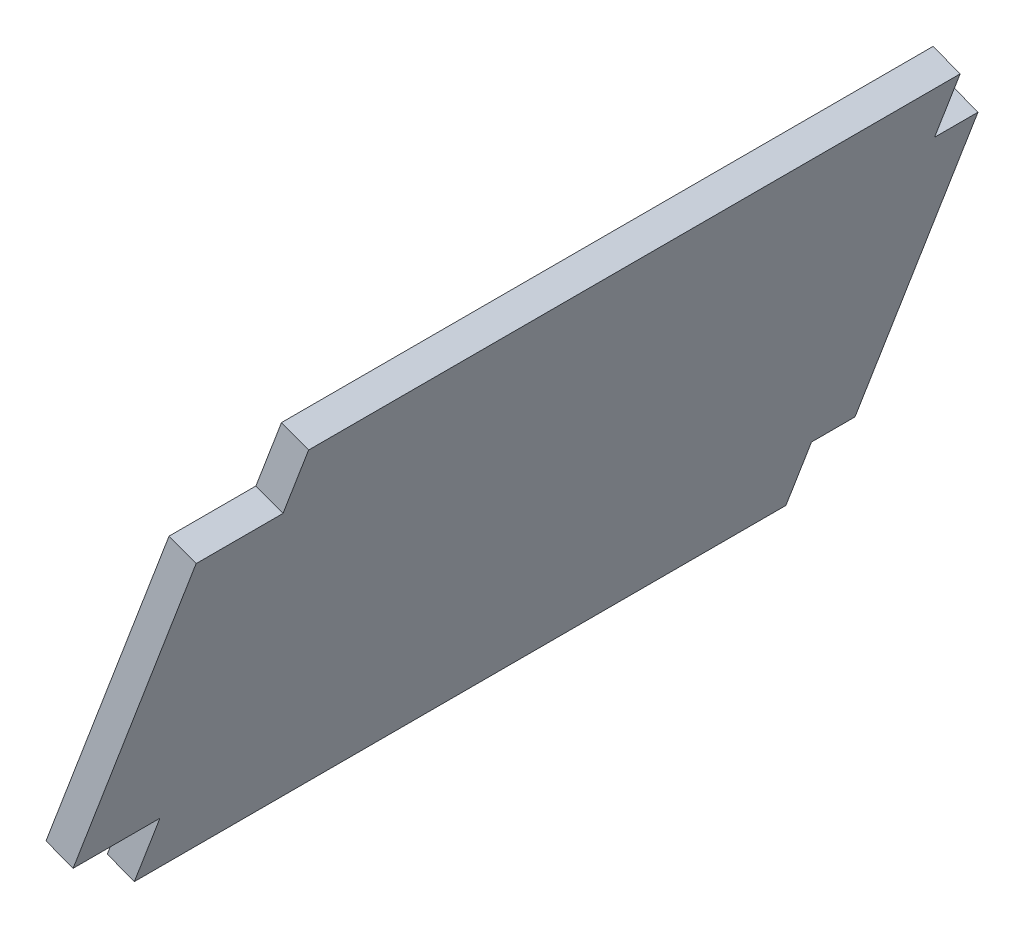
ISO-10303-21;
HEADER;
FILE_DESCRIPTION(('STEP AP214'),'2;1');
FILE_NAME('part.step','',(''),(''),'','','');
FILE_SCHEMA(('AUTOMOTIVE_DESIGN { 1 0 10303 214 1 1 1 1 }'));
ENDSEC;
DATA;
#1=APPLICATION_CONTEXT('core data for automotive mechanical design processes');
#2=APPLICATION_PROTOCOL_DEFINITION('international standard','automotive_design',2000,#1);
#3=PRODUCT_CONTEXT('',#1,'mechanical');
#4=PRODUCT('Part','Part','',(#3));
#5=PRODUCT_RELATED_PRODUCT_CATEGORY('part','',(#4));
#6=PRODUCT_DEFINITION_FORMATION('','',#4);
#7=PRODUCT_DEFINITION_CONTEXT('part definition',#1,'design');
#8=PRODUCT_DEFINITION('design','',#6,#7);
#9=PRODUCT_DEFINITION_SHAPE('','',#8);
#10=(LENGTH_UNIT() NAMED_UNIT(*) SI_UNIT(.MILLI.,.METRE.));
#11=(NAMED_UNIT(*) PLANE_ANGLE_UNIT() SI_UNIT($,.RADIAN.));
#12=(NAMED_UNIT(*) SI_UNIT($,.STERADIAN.) SOLID_ANGLE_UNIT());
#13=UNCERTAINTY_MEASURE_WITH_UNIT(LENGTH_MEASURE(1.E-05),#10,'distance_accuracy_value','');
#14=(GEOMETRIC_REPRESENTATION_CONTEXT(3) GLOBAL_UNCERTAINTY_ASSIGNED_CONTEXT((#13)) GLOBAL_UNIT_ASSIGNED_CONTEXT((#10,
#11,#12)) REPRESENTATION_CONTEXT('',''));
#15=CARTESIAN_POINT('',(0.,0.,0.));
#16=DIRECTION('',(0.,0.,1.));
#17=DIRECTION('',(1.,0.,0.));
#18=AXIS2_PLACEMENT_3D('',#15,#16,#17);
#19=CARTESIAN_POINT('',(227.031313309639,-60.5629079915328,-73.3961625225206));
#20=DIRECTION('',(0.353621589287121,0.935388567168773,0.));
#21=DIRECTION('',(-0.935388567168774,0.353621589287121,0.));
#22=AXIS2_PLACEMENT_3D('',#19,#20,#21);
#23=PLANE('',#22);
#24=DIRECTION('',(0.,0.,1.));
#25=VECTOR('',#24,1.);
#26=CARTESIAN_POINT('',(227.031313309639,-60.5629079915328,-73.3961625225206));
#27=LINE('',#26,#25);
#28=CARTESIAN_POINT('',(227.031313309639,-60.5629079915328,-48.));
#29=VERTEX_POINT('',#28);
#30=CARTESIAN_POINT('',(227.031313309638,-60.562907991533,-45.));
#31=VERTEX_POINT('',#30);
#32=EDGE_CURVE('E179',#29,#31,#27,.T.);
#33=ORIENTED_EDGE('',*,*,#32,.F.);
#34=DIRECTION('',(0.935388567168774,-0.353621589287121,0.));
#35=VECTOR('',#34,1.);
#36=CARTESIAN_POINT('',(227.031313309639,-60.5629079915328,-48.));
#37=LINE('',#36,#35);
#38=CARTESIAN_POINT('',(228.902090443976,-61.270151170107,-48.));
#39=VERTEX_POINT('',#38);
#40=EDGE_CURVE('E11',#29,#39,#37,.T.);
#41=ORIENTED_EDGE('',*,*,#40,.T.);
#42=DIRECTION('',(0.,0.,1.));
#43=VECTOR('',#42,1.);
#44=CARTESIAN_POINT('',(228.902090443976,-61.270151170107,-73.3961625225206));
#45=LINE('',#44,#43);
#46=CARTESIAN_POINT('',(228.902090443976,-61.2701511701072,-45.));
#47=VERTEX_POINT('',#46);
#48=EDGE_CURVE('E181',#39,#47,#45,.T.);
#49=ORIENTED_EDGE('',*,*,#48,.T.);
#50=DIRECTION('',(0.935388567168775,-0.353621589287116,0.));
#51=VECTOR('',#50,1.);
#52=CARTESIAN_POINT('',(227.031313309638,-60.562907991533,-45.));
#53=LINE('',#52,#51);
#54=EDGE_CURVE('E146',#31,#47,#53,.T.);
#55=ORIENTED_EDGE('',*,*,#54,.F.);
#56=EDGE_LOOP('',(#33,#41,#49,#55));
#57=FACE_BOUND('',#56,.T.);
#58=ADVANCED_FACE('F33',(#57),#23,.F.);
#59=CARTESIAN_POINT('',(237.399172674298,-38.7939398376526,-73.3961625225206));
#60=DIRECTION('',(-0.353621589287121,-0.935388567168773,0.));
#61=DIRECTION('',(0.935388567168774,-0.353621589287121,0.));
#62=AXIS2_PLACEMENT_3D('',#59,#60,#61);
#63=PLANE('',#62);
#64=DIRECTION('',(-0.935388567168772,0.353621589287125,0.));
#65=VECTOR('',#64,1.);
#66=CARTESIAN_POINT('',(235.52839553996,-38.0866966590784,0.));
#67=LINE('',#66,#65);
#68=CARTESIAN_POINT('',(237.399172674298,-38.7939398376526,0.));
#69=VERTEX_POINT('',#68);
#70=CARTESIAN_POINT('',(235.52839553996,-38.0866966590784,0.));
#71=VERTEX_POINT('',#70);
#72=EDGE_CURVE('E228',#69,#71,#67,.T.);
#73=ORIENTED_EDGE('',*,*,#72,.T.);
#74=DIRECTION('',(0.,0.,1.));
#75=VECTOR('',#74,1.);
#76=CARTESIAN_POINT('',(235.52839553996,-38.0866966590784,-73.3961625225206));
#77=LINE('',#76,#75);
#78=CARTESIAN_POINT('',(235.52839553996,-38.0866966590784,6.));
#79=VERTEX_POINT('',#78);
#80=EDGE_CURVE('E253',#71,#79,#77,.T.);
#81=ORIENTED_EDGE('',*,*,#80,.T.);
#82=DIRECTION('',(0.935388567168773,-0.35362158928712,0.));
#83=VECTOR('',#82,1.);
#84=CARTESIAN_POINT('',(237.399172674298,-38.7939398376526,6.));
#85=LINE('',#84,#83);
#86=CARTESIAN_POINT('',(237.399172674298,-38.7939398376526,6.));
#87=VERTEX_POINT('',#86);
#88=EDGE_CURVE('E215',#79,#87,#85,.T.);
#89=ORIENTED_EDGE('',*,*,#88,.T.);
#90=DIRECTION('',(0.,0.,1.));
#91=VECTOR('',#90,1.);
#92=CARTESIAN_POINT('',(237.399172674298,-38.7939398376526,-73.3961625225206));
#93=LINE('',#92,#91);
#94=EDGE_CURVE('E214',#69,#87,#93,.T.);
#95=ORIENTED_EDGE('',*,*,#94,.F.);
#96=EDGE_LOOP('',(#73,#81,#89,#95));
#97=FACE_BOUND('',#96,.T.);
#98=ADVANCED_FACE('F284',(#97),#63,.F.);
#99=DIRECTION('',(0.935388567168771,-0.353621589287127,0.));
#100=VECTOR('',#99,1.);
#101=CARTESIAN_POINT('',(235.52839553996,-38.0866966590784,-45.));
#102=LINE('',#101,#100);
#103=CARTESIAN_POINT('',(235.52839553996,-38.0866966590784,-45.));
#104=VERTEX_POINT('',#103);
#105=CARTESIAN_POINT('',(237.399172674298,-38.7939398376527,-45.));
#106=VERTEX_POINT('',#105);
#107=EDGE_CURVE('E140',#104,#106,#102,.T.);
#108=ORIENTED_EDGE('',*,*,#107,.T.);
#109=CARTESIAN_POINT('',(237.399172674298,-38.7939398376526,-48.));
#110=VERTEX_POINT('',#109);
#111=EDGE_CURVE('E256',#110,#106,#93,.T.);
#112=ORIENTED_EDGE('',*,*,#111,.F.);
#113=DIRECTION('',(-0.935388567168774,0.353621589287121,0.));
#114=VECTOR('',#113,1.);
#115=CARTESIAN_POINT('',(237.399172674298,-38.7939398376526,-48.));
#116=LINE('',#115,#114);
#117=CARTESIAN_POINT('',(235.52839553996,-38.0866966590784,-48.));
#118=VERTEX_POINT('',#117);
#119=EDGE_CURVE('E204',#110,#118,#116,.T.);
#120=ORIENTED_EDGE('',*,*,#119,.T.);
#121=EDGE_CURVE('E187',#118,#104,#77,.T.);
#122=ORIENTED_EDGE('',*,*,#121,.T.);
#123=EDGE_LOOP('',(#108,#112,#120,#122));
#124=FACE_BOUND('',#123,.T.);
#125=ADVANCED_FACE('F262',(#124),#63,.F.);
#126=CARTESIAN_POINT('',(235.52839553996,-38.0866966590784,-73.3961625225206));
#127=DIRECTION('',(0.935388567168774,-0.353621589287119,0.));
#128=DIRECTION('',(0.353621589287119,0.935388567168774,0.));
#129=AXIS2_PLACEMENT_3D('',#126,#127,#128);
#130=PLANE('',#129);
#131=DIRECTION('',(-0.353621589287119,-0.935388567168774,0.));
#132=VECTOR('',#131,1.);
#133=CARTESIAN_POINT('',(235.52839553996,-38.0866966590784,-48.));
#134=LINE('',#133,#132);
#135=EDGE_CURVE('E42',#118,#29,#134,.T.);
#136=ORIENTED_EDGE('',*,*,#135,.T.);
#137=ORIENTED_EDGE('',*,*,#32,.T.);
#138=DIRECTION('',(0.353621589287122,0.935388567168773,0.));
#139=VECTOR('',#138,1.);
#140=CARTESIAN_POINT('',(225.263205363203,-65.2398508273769,-45.));
#141=LINE('',#140,#139);
#142=CARTESIAN_POINT('',(225.263205363203,-65.2398508273769,-45.));
#143=VERTEX_POINT('',#142);
#144=EDGE_CURVE('E145',#143,#31,#141,.T.);
#145=ORIENTED_EDGE('',*,*,#144,.F.);
#146=DIRECTION('',(0.,0.,-1.));
#147=VECTOR('',#146,1.);
#148=CARTESIAN_POINT('',(225.263205363203,-65.2398508273769,0.));
#149=LINE('',#148,#147);
#150=CARTESIAN_POINT('',(225.263205363203,-65.2398508273769,0.));
#151=VERTEX_POINT('',#150);
#152=EDGE_CURVE('E129',#151,#143,#149,.T.);
#153=ORIENTED_EDGE('',*,*,#152,.F.);
#154=DIRECTION('',(0.353621589287122,0.935388567168773,0.));
#155=VECTOR('',#154,1.);
#156=CARTESIAN_POINT('',(225.263205363203,-65.2398508273769,0.));
#157=LINE('',#156,#155);
#158=CARTESIAN_POINT('',(227.031313309639,-60.5629079915328,0.));
#159=VERTEX_POINT('',#158);
#160=EDGE_CURVE('E136',#151,#159,#157,.T.);
#161=ORIENTED_EDGE('',*,*,#160,.T.);
#162=CARTESIAN_POINT('',(227.031313309639,-60.5629079915328,6.));
#163=VERTEX_POINT('',#162);
#164=EDGE_CURVE('E184',#159,#163,#27,.T.);
#165=ORIENTED_EDGE('',*,*,#164,.T.);
#166=DIRECTION('',(0.353621589287119,0.935388567168774,0.));
#167=VECTOR('',#166,1.);
#168=CARTESIAN_POINT('',(235.52839553996,-38.0866966590784,6.));
#169=LINE('',#168,#167);
#170=EDGE_CURVE('E212',#163,#79,#169,.T.);
#171=ORIENTED_EDGE('',*,*,#170,.T.);
#172=ORIENTED_EDGE('',*,*,#80,.F.);
#173=DIRECTION('',(-0.353621589287121,-0.935388567168773,0.));
#174=VECTOR('',#173,1.);
#175=CARTESIAN_POINT('',(237.296503486396,-33.4097538232346,0.));
#176=LINE('',#175,#174);
#177=CARTESIAN_POINT('',(237.296503486396,-33.4097538232346,0.));
#178=VERTEX_POINT('',#177);
#179=EDGE_CURVE('E58',#178,#71,#176,.T.);
#180=ORIENTED_EDGE('',*,*,#179,.F.);
#181=DIRECTION('',(0.,0.,-1.));
#182=VECTOR('',#181,1.);
#183=CARTESIAN_POINT('',(237.296503486396,-33.4097538232346,0.));
#184=LINE('',#183,#182);
#185=CARTESIAN_POINT('',(237.296503486396,-33.4097538232345,-45.));
#186=VERTEX_POINT('',#185);
#187=EDGE_CURVE('E232',#178,#186,#184,.T.);
#188=ORIENTED_EDGE('',*,*,#187,.T.);
#189=DIRECTION('',(-0.353621589287121,-0.935388567168773,0.));
#190=VECTOR('',#189,1.);
#191=CARTESIAN_POINT('',(237.296503486396,-33.4097538232345,-45.));
#192=LINE('',#191,#190);
#193=EDGE_CURVE('E222',#186,#104,#192,.T.);
#194=ORIENTED_EDGE('',*,*,#193,.T.);
#195=ORIENTED_EDGE('',*,*,#121,.F.);
#196=EDGE_LOOP('',(#136,#137,#145,#153,#161,#165,#171,#172,#180,#188,#194,#195));
#197=FACE_BOUND('',#196,.T.);
#198=ADVANCED_FACE('F143',(#197),#130,.F.);
#199=CARTESIAN_POINT('',(228.902090443976,-61.2701511701072,0.));
#200=VERTEX_POINT('',#199);
#201=CARTESIAN_POINT('',(228.902090443976,-61.270151170107,6.));
#202=VERTEX_POINT('',#201);
#203=EDGE_CURVE('E160',#200,#202,#45,.T.);
#204=ORIENTED_EDGE('',*,*,#203,.T.);
#205=DIRECTION('',(-0.935388567168773,0.35362158928712,0.));
#206=VECTOR('',#205,1.);
#207=CARTESIAN_POINT('',(227.031313309639,-60.5629079915328,6.));
#208=LINE('',#207,#206);
#209=EDGE_CURVE('E220',#202,#163,#208,.T.);
#210=ORIENTED_EDGE('',*,*,#209,.T.);
#211=ORIENTED_EDGE('',*,*,#164,.F.);
#212=DIRECTION('',(-0.935388567168775,0.353621589287117,0.));
#213=VECTOR('',#212,1.);
#214=CARTESIAN_POINT('',(227.031313309639,-60.562907991533,0.));
#215=LINE('',#214,#213);
#216=EDGE_CURVE('E50',#200,#159,#215,.T.);
#217=ORIENTED_EDGE('',*,*,#216,.F.);
#218=EDGE_LOOP('',(#204,#210,#211,#217));
#219=FACE_BOUND('',#218,.T.);
#220=ADVANCED_FACE('F286',(#219),#23,.F.);
#221=CARTESIAN_POINT('',(228.902090443976,-61.270151170107,-73.3961625225206));
#222=DIRECTION('',(-0.935388567168774,0.353621589287119,0.));
#223=DIRECTION('',(-0.353621589287119,-0.935388567168774,0.));
#224=AXIS2_PLACEMENT_3D('',#221,#222,#223);
#225=PLANE('',#224);
#226=DIRECTION('',(0.353621589287119,0.935388567168774,0.));
#227=VECTOR('',#226,1.);
#228=CARTESIAN_POINT('',(228.902090443976,-61.270151170107,-48.));
#229=LINE('',#228,#227);
#230=EDGE_CURVE('E203',#39,#110,#229,.T.);
#231=ORIENTED_EDGE('',*,*,#230,.T.);
#232=ORIENTED_EDGE('',*,*,#111,.T.);
#233=DIRECTION('',(-0.353621589287121,-0.935388567168773,0.));
#234=VECTOR('',#233,1.);
#235=CARTESIAN_POINT('',(239.167280620733,-34.1169970018088,-45.));
#236=LINE('',#235,#234);
#237=CARTESIAN_POINT('',(239.167280620733,-34.1169970018088,-45.));
#238=VERTEX_POINT('',#237);
#239=EDGE_CURVE('E239',#238,#106,#236,.T.);
#240=ORIENTED_EDGE('',*,*,#239,.F.);
#241=DIRECTION('',(0.,0.,1.));
#242=VECTOR('',#241,1.);
#243=CARTESIAN_POINT('',(239.167280620733,-34.1169970018088,0.));
#244=LINE('',#243,#242);
#245=CARTESIAN_POINT('',(239.167280620733,-34.1169970018088,0.));
#246=VERTEX_POINT('',#245);
#247=EDGE_CURVE('E270',#238,#246,#244,.T.);
#248=ORIENTED_EDGE('',*,*,#247,.T.);
#249=DIRECTION('',(-0.353621589287121,-0.935388567168773,0.));
#250=VECTOR('',#249,1.);
#251=CARTESIAN_POINT('',(239.167280620733,-34.1169970018088,0.));
#252=LINE('',#251,#250);
#253=EDGE_CURVE('E236',#246,#69,#252,.T.);
#254=ORIENTED_EDGE('',*,*,#253,.T.);
#255=ORIENTED_EDGE('',*,*,#94,.T.);
#256=DIRECTION('',(-0.353621589287119,-0.935388567168774,0.));
#257=VECTOR('',#256,1.);
#258=CARTESIAN_POINT('',(228.902090443976,-61.270151170107,6.));
#259=LINE('',#258,#257);
#260=EDGE_CURVE('E218',#87,#202,#259,.T.);
#261=ORIENTED_EDGE('',*,*,#260,.T.);
#262=ORIENTED_EDGE('',*,*,#203,.F.);
#263=DIRECTION('',(0.353621589287122,0.935388567168773,0.));
#264=VECTOR('',#263,1.);
#265=CARTESIAN_POINT('',(227.13398249754,-65.9470940059511,0.));
#266=LINE('',#265,#264);
#267=CARTESIAN_POINT('',(227.13398249754,-65.9470940059511,0.));
#268=VERTEX_POINT('',#267);
#269=EDGE_CURVE('E141',#268,#200,#266,.T.);
#270=ORIENTED_EDGE('',*,*,#269,.F.);
#271=DIRECTION('',(0.,0.,1.));
#272=VECTOR('',#271,1.);
#273=CARTESIAN_POINT('',(227.13398249754,-65.9470940059511,0.));
#274=LINE('',#273,#272);
#275=CARTESIAN_POINT('',(227.13398249754,-65.9470940059511,-45.));
#276=VERTEX_POINT('',#275);
#277=EDGE_CURVE('E132',#276,#268,#274,.T.);
#278=ORIENTED_EDGE('',*,*,#277,.F.);
#279=DIRECTION('',(0.353621589287122,0.935388567168773,0.));
#280=VECTOR('',#279,1.);
#281=CARTESIAN_POINT('',(227.13398249754,-65.9470940059511,-45.));
#282=LINE('',#281,#280);
#283=EDGE_CURVE('E167',#276,#47,#282,.T.);
#284=ORIENTED_EDGE('',*,*,#283,.T.);
#285=ORIENTED_EDGE('',*,*,#48,.F.);
#286=EDGE_LOOP('',(#231,#232,#240,#248,#254,#255,#261,#262,#270,#278,#284,#285));
#287=FACE_BOUND('',#286,.T.);
#288=ADVANCED_FACE('F260',(#287),#225,.F.);
#289=CARTESIAN_POINT('',(0.,0.,-48.));
#290=DIRECTION('',(0.,0.,-1.));
#291=DIRECTION('',(0.,-1.,0.));
#292=AXIS2_PLACEMENT_3D('',#289,#290,#291);
#293=PLANE('',#292);
#294=ORIENTED_EDGE('',*,*,#230,.F.);
#295=ORIENTED_EDGE('',*,*,#40,.F.);
#296=ORIENTED_EDGE('',*,*,#135,.F.);
#297=ORIENTED_EDGE('',*,*,#119,.F.);
#298=EDGE_LOOP('',(#294,#295,#296,#297));
#299=FACE_BOUND('',#298,.T.);
#300=ADVANCED_FACE('F35',(#299),#293,.T.);
#301=CARTESIAN_POINT('',(0.,0.,6.));
#302=DIRECTION('',(0.,0.,-1.));
#303=DIRECTION('',(0.,-1.,0.));
#304=AXIS2_PLACEMENT_3D('',#301,#302,#303);
#305=PLANE('',#304);
#306=ORIENTED_EDGE('',*,*,#88,.F.);
#307=ORIENTED_EDGE('',*,*,#170,.F.);
#308=ORIENTED_EDGE('',*,*,#209,.F.);
#309=ORIENTED_EDGE('',*,*,#260,.F.);
#310=EDGE_LOOP('',(#306,#307,#308,#309));
#311=FACE_BOUND('',#310,.T.);
#312=ADVANCED_FACE('F304',(#311),#305,.F.);
#313=CARTESIAN_POINT('',(237.296503486396,-33.4097538232345,-45.));
#314=DIRECTION('',(0.,0.,1.));
#315=DIRECTION('',(-1.,0.,0.));
#316=AXIS2_PLACEMENT_3D('',#313,#314,#315);
#317=PLANE('',#316);
#318=ORIENTED_EDGE('',*,*,#107,.F.);
#319=ORIENTED_EDGE('',*,*,#193,.F.);
#320=DIRECTION('',(0.935388567168771,-0.353621589287127,0.));
#321=VECTOR('',#320,1.);
#322=CARTESIAN_POINT('',(237.296503486396,-33.4097538232345,-45.));
#323=LINE('',#322,#321);
#324=EDGE_CURVE('E266',#186,#238,#323,.T.);
#325=ORIENTED_EDGE('',*,*,#324,.T.);
#326=ORIENTED_EDGE('',*,*,#239,.T.);
#327=EDGE_LOOP('',(#318,#319,#325,#326));
#328=FACE_BOUND('',#327,.T.);
#329=ADVANCED_FACE('F264',(#328),#317,.F.);
#330=CARTESIAN_POINT('',(237.296503486396,-33.4097538232346,0.));
#331=DIRECTION('',(0.,0.,-1.));
#332=DIRECTION('',(1.,0.,0.));
#333=AXIS2_PLACEMENT_3D('',#330,#331,#332);
#334=PLANE('',#333);
#335=ORIENTED_EDGE('',*,*,#72,.F.);
#336=ORIENTED_EDGE('',*,*,#253,.F.);
#337=DIRECTION('',(-0.935388567168772,0.353621589287125,0.));
#338=VECTOR('',#337,1.);
#339=CARTESIAN_POINT('',(237.296503486396,-33.4097538232346,0.));
#340=LINE('',#339,#338);
#341=EDGE_CURVE('E237',#246,#178,#340,.T.);
#342=ORIENTED_EDGE('',*,*,#341,.T.);
#343=ORIENTED_EDGE('',*,*,#179,.T.);
#344=EDGE_LOOP('',(#335,#336,#342,#343));
#345=FACE_BOUND('',#344,.T.);
#346=ADVANCED_FACE('F273',(#345),#334,.F.);
#347=CARTESIAN_POINT('',(18.6224430981499,49.2594934655324,0.));
#348=DIRECTION('',(0.353621589287127,0.935388567168771,0.));
#349=DIRECTION('',(-0.935388567168771,0.353621589287127,0.));
#350=AXIS2_PLACEMENT_3D('',#347,#348,#349);
#351=PLANE('',#350);
#352=ORIENTED_EDGE('',*,*,#187,.F.);
#353=ORIENTED_EDGE('',*,*,#341,.F.);
#354=ORIENTED_EDGE('',*,*,#247,.F.);
#355=ORIENTED_EDGE('',*,*,#324,.F.);
#356=EDGE_LOOP('',(#352,#353,#354,#355));
#357=FACE_BOUND('',#356,.T.);
#358=ADVANCED_FACE('F274',(#357),#351,.T.);
#359=CARTESIAN_POINT('',(225.263205363203,-65.2398508273769,0.));
#360=DIRECTION('',(0.,0.,1.));
#361=DIRECTION('',(-1.,0.,0.));
#362=AXIS2_PLACEMENT_3D('',#359,#360,#361);
#363=PLANE('',#362);
#364=ORIENTED_EDGE('',*,*,#216,.T.);
#365=ORIENTED_EDGE('',*,*,#160,.F.);
#366=DIRECTION('',(-0.935388567168775,0.353621589287117,0.));
#367=VECTOR('',#366,1.);
#368=CARTESIAN_POINT('',(225.263205363203,-65.2398508273769,0.));
#369=LINE('',#368,#367);
#370=EDGE_CURVE('E126',#268,#151,#369,.T.);
#371=ORIENTED_EDGE('',*,*,#370,.F.);
#372=ORIENTED_EDGE('',*,*,#269,.T.);
#373=EDGE_LOOP('',(#364,#365,#371,#372));
#374=FACE_BOUND('',#373,.T.);
#375=ADVANCED_FACE('F137',(#374),#363,.T.);
#376=CARTESIAN_POINT('',(225.263205363203,-65.2398508273769,-45.));
#377=DIRECTION('',(0.,0.,-1.));
#378=DIRECTION('',(1.,0.,0.));
#379=AXIS2_PLACEMENT_3D('',#376,#377,#378);
#380=PLANE('',#379);
#381=ORIENTED_EDGE('',*,*,#54,.T.);
#382=ORIENTED_EDGE('',*,*,#283,.F.);
#383=DIRECTION('',(0.935388567168775,-0.353621589287116,0.));
#384=VECTOR('',#383,1.);
#385=CARTESIAN_POINT('',(225.263205363203,-65.2398508273769,-45.));
#386=LINE('',#385,#384);
#387=EDGE_CURVE('E152',#143,#276,#386,.T.);
#388=ORIENTED_EDGE('',*,*,#387,.F.);
#389=ORIENTED_EDGE('',*,*,#144,.T.);
#390=EDGE_LOOP('',(#381,#382,#388,#389));
#391=FACE_BOUND('',#390,.T.);
#392=ADVANCED_FACE('F174',(#391),#380,.T.);
#393=CARTESIAN_POINT('',(6.58914497495606,17.4293964613876,0.));
#394=DIRECTION('',(-0.353621589287116,-0.935388567168775,0.));
#395=DIRECTION('',(-0.935388567168775,0.353621589287116,0.));
#396=AXIS2_PLACEMENT_3D('',#393,#394,#395);
#397=PLANE('',#396);
#398=ORIENTED_EDGE('',*,*,#152,.T.);
#399=ORIENTED_EDGE('',*,*,#387,.T.);
#400=ORIENTED_EDGE('',*,*,#277,.T.);
#401=ORIENTED_EDGE('',*,*,#370,.T.);
#402=EDGE_LOOP('',(#398,#399,#400,#401));
#403=FACE_BOUND('',#402,.T.);
#404=ADVANCED_FACE('F127',(#403),#397,.T.);
#405=CLOSED_SHELL('',(#58,#98,#125,#198,#220,#288,#300,#312,#329,#346,#358,#375,#392,#404));
#406=MANIFOLD_SOLID_BREP('B2',#405);
#407=ADVANCED_BREP_SHAPE_REPRESENTATION('',(#18,#406),#14);
#408=SHAPE_DEFINITION_REPRESENTATION(#9,#407);
ENDSEC;
END-ISO-10303-21;
